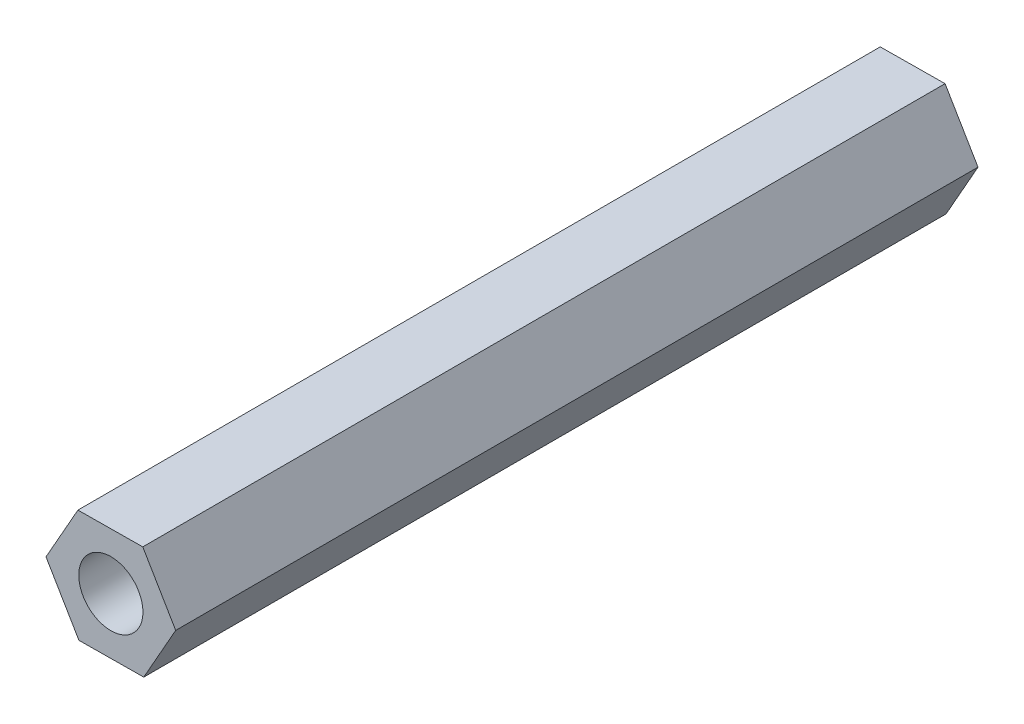
ISO-10303-21;
HEADER;
FILE_DESCRIPTION(('STEP AP214'),'2;1');
FILE_NAME('part.step','',(''),(''),'','','');
FILE_SCHEMA(('AUTOMOTIVE_DESIGN { 1 0 10303 214 1 1 1 1 }'));
ENDSEC;
DATA;
#1=APPLICATION_CONTEXT('core data for automotive mechanical design processes');
#2=APPLICATION_PROTOCOL_DEFINITION('international standard','automotive_design',2000,#1);
#3=PRODUCT_CONTEXT('',#1,'mechanical');
#4=PRODUCT('Part','Part','',(#3));
#5=PRODUCT_RELATED_PRODUCT_CATEGORY('part','',(#4));
#6=PRODUCT_DEFINITION_FORMATION('','',#4);
#7=PRODUCT_DEFINITION_CONTEXT('part definition',#1,'design');
#8=PRODUCT_DEFINITION('design','',#6,#7);
#9=PRODUCT_DEFINITION_SHAPE('','',#8);
#10=(LENGTH_UNIT() NAMED_UNIT(*) SI_UNIT(.MILLI.,.METRE.));
#11=(NAMED_UNIT(*) PLANE_ANGLE_UNIT() SI_UNIT($,.RADIAN.));
#12=(NAMED_UNIT(*) SI_UNIT($,.STERADIAN.) SOLID_ANGLE_UNIT());
#13=UNCERTAINTY_MEASURE_WITH_UNIT(LENGTH_MEASURE(1.E-05),#10,'distance_accuracy_value','');
#14=(GEOMETRIC_REPRESENTATION_CONTEXT(3) GLOBAL_UNCERTAINTY_ASSIGNED_CONTEXT((#13)) GLOBAL_UNIT_ASSIGNED_CONTEXT((#10,
#11,#12)) REPRESENTATION_CONTEXT('',''));
#15=CARTESIAN_POINT('',(0.,0.,0.));
#16=DIRECTION('',(0.,0.,1.));
#17=DIRECTION('',(1.,0.,0.));
#18=AXIS2_PLACEMENT_3D('',#15,#16,#17);
#19=CARTESIAN_POINT('',(0.,0.,50.));
#20=DIRECTION('',(0.,0.,1.));
#21=DIRECTION('',(1.,0.,0.));
#22=AXIS2_PLACEMENT_3D('',#19,#20,#21);
#23=PLANE('',#22);
#24=DIRECTION('',(0.999961257640527,0.00880245522430722,0.));
#25=VECTOR('',#24,1.);
#26=CARTESIAN_POINT('',(-1.98983906118775,-3.51765175136834,50.));
#27=LINE('',#26,#25);
#28=CARTESIAN_POINT('',(-1.98983906118775,-3.51765175136834,50.));
#29=VERTEX_POINT('',#28);
#30=CARTESIAN_POINT('',(2.05145624775792,-3.48207705211536,50.));
#31=VERTEX_POINT('',#30);
#32=EDGE_CURVE('E133',#29,#31,#27,.T.);
#33=ORIENTED_EDGE('',*,*,#32,.T.);
#34=DIRECTION('',(0.492357478980338,0.870393079529086,0.));
#35=VECTOR('',#34,1.);
#36=CARTESIAN_POINT('',(2.05145624775792,-3.48207705211536,50.));
#37=LINE('',#36,#35);
#38=CARTESIAN_POINT('',(4.04129530894568,0.0355746992529791,50.));
#39=VERTEX_POINT('',#38);
#40=EDGE_CURVE('E91',#31,#39,#37,.T.);
#41=ORIENTED_EDGE('',*,*,#40,.T.);
#42=DIRECTION('',(-0.507603778660189,0.861590624304779,0.));
#43=VECTOR('',#42,1.);
#44=CARTESIAN_POINT('',(4.04129530894568,0.0355746992529791,50.));
#45=LINE('',#44,#43);
#46=CARTESIAN_POINT('',(1.98983906118776,3.51765175136834,50.));
#47=VERTEX_POINT('',#46);
#48=EDGE_CURVE('E104',#39,#47,#45,.T.);
#49=ORIENTED_EDGE('',*,*,#48,.T.);
#50=DIRECTION('',(-0.999961257640527,-0.00880245522430723,0.));
#51=VECTOR('',#50,1.);
#52=CARTESIAN_POINT('',(1.98983906118776,3.51765175136834,50.));
#53=LINE('',#52,#51);
#54=CARTESIAN_POINT('',(-2.05145624775791,3.48207705211536,50.));
#55=VERTEX_POINT('',#54);
#56=EDGE_CURVE('E98',#47,#55,#53,.T.);
#57=ORIENTED_EDGE('',*,*,#56,.T.);
#58=DIRECTION('',(-0.492357478980338,-0.870393079529086,0.));
#59=VECTOR('',#58,1.);
#60=CARTESIAN_POINT('',(-2.05145624775791,3.48207705211536,50.));
#61=LINE('',#60,#59);
#62=CARTESIAN_POINT('',(-4.04129530894568,-0.0355746992529825,50.));
#63=VERTEX_POINT('',#62);
#64=EDGE_CURVE('E102',#55,#63,#61,.T.);
#65=ORIENTED_EDGE('',*,*,#64,.T.);
#66=DIRECTION('',(0.507603778660189,-0.861590624304779,0.));
#67=VECTOR('',#66,1.);
#68=CARTESIAN_POINT('',(-4.04129530894568,-0.0355746992529825,50.));
#69=LINE('',#68,#67);
#70=EDGE_CURVE('E54',#63,#29,#69,.T.);
#71=ORIENTED_EDGE('',*,*,#70,.T.);
#72=EDGE_LOOP('',(#33,#41,#49,#57,#65,#71));
#73=FACE_BOUND('',#72,.T.);
#74=CARTESIAN_POINT('',(0.,0.,50.));
#75=DIRECTION('',(0.,0.,1.));
#76=DIRECTION('',(1.,0.,0.));
#77=AXIS2_PLACEMENT_3D('',#74,#75,#76);
#78=CIRCLE('',#77,2.);
#79=CARTESIAN_POINT('',(2.,0.,50.));
#80=VERTEX_POINT('',#79);
#81=EDGE_CURVE('E126',#80,#80,#78,.T.);
#82=ORIENTED_EDGE('',*,*,#81,.F.);
#83=EDGE_LOOP('',(#82));
#84=FACE_BOUND('',#83,.T.);
#85=ADVANCED_FACE('F37',(#73,#84),#23,.T.);
#86=CARTESIAN_POINT('',(0.,0.,0.));
#87=DIRECTION('',(0.,0.,1.));
#88=DIRECTION('',(1.,0.,0.));
#89=AXIS2_PLACEMENT_3D('',#86,#87,#88);
#90=PLANE('',#89);
#91=DIRECTION('',(0.999961257640527,0.00880245522430722,0.));
#92=VECTOR('',#91,1.);
#93=CARTESIAN_POINT('',(-1.98983906118775,-3.51765175136834,0.));
#94=LINE('',#93,#92);
#95=CARTESIAN_POINT('',(-1.98983906118775,-3.51765175136834,0.));
#96=VERTEX_POINT('',#95);
#97=CARTESIAN_POINT('',(2.05145624775792,-3.48207705211536,0.));
#98=VERTEX_POINT('',#97);
#99=EDGE_CURVE('E122',#96,#98,#94,.T.);
#100=ORIENTED_EDGE('',*,*,#99,.F.);
#101=DIRECTION('',(0.507603778660189,-0.861590624304779,0.));
#102=VECTOR('',#101,1.);
#103=CARTESIAN_POINT('',(-4.04129530894568,-0.0355746992529825,0.));
#104=LINE('',#103,#102);
#105=CARTESIAN_POINT('',(-4.04129530894568,-0.0355746992529825,0.));
#106=VERTEX_POINT('',#105);
#107=EDGE_CURVE('E83',#106,#96,#104,.T.);
#108=ORIENTED_EDGE('',*,*,#107,.F.);
#109=DIRECTION('',(-0.492357478980338,-0.870393079529086,0.));
#110=VECTOR('',#109,1.);
#111=CARTESIAN_POINT('',(-2.05145624775791,3.48207705211536,0.));
#112=LINE('',#111,#110);
#113=CARTESIAN_POINT('',(-2.05145624775791,3.48207705211536,0.));
#114=VERTEX_POINT('',#113);
#115=EDGE_CURVE('E77',#114,#106,#112,.T.);
#116=ORIENTED_EDGE('',*,*,#115,.F.);
#117=DIRECTION('',(-0.999961257640527,-0.00880245522430723,0.));
#118=VECTOR('',#117,1.);
#119=CARTESIAN_POINT('',(1.98983906118776,3.51765175136834,0.));
#120=LINE('',#119,#118);
#121=CARTESIAN_POINT('',(1.98983906118776,3.51765175136834,0.));
#122=VERTEX_POINT('',#121);
#123=EDGE_CURVE('E112',#122,#114,#120,.T.);
#124=ORIENTED_EDGE('',*,*,#123,.F.);
#125=DIRECTION('',(-0.507603778660189,0.861590624304779,0.));
#126=VECTOR('',#125,1.);
#127=CARTESIAN_POINT('',(4.04129530894568,0.0355746992529791,0.));
#128=LINE('',#127,#126);
#129=CARTESIAN_POINT('',(4.04129530894568,0.0355746992529791,0.));
#130=VERTEX_POINT('',#129);
#131=EDGE_CURVE('E128',#130,#122,#128,.T.);
#132=ORIENTED_EDGE('',*,*,#131,.F.);
#133=DIRECTION('',(0.492357478980338,0.870393079529086,0.));
#134=VECTOR('',#133,1.);
#135=CARTESIAN_POINT('',(2.05145624775792,-3.48207705211536,0.));
#136=LINE('',#135,#134);
#137=EDGE_CURVE('E125',#98,#130,#136,.T.);
#138=ORIENTED_EDGE('',*,*,#137,.F.);
#139=EDGE_LOOP('',(#100,#108,#116,#124,#132,#138));
#140=FACE_BOUND('',#139,.T.);
#141=CARTESIAN_POINT('',(0.,0.,0.));
#142=DIRECTION('',(0.,0.,1.));
#143=DIRECTION('',(1.,0.,0.));
#144=AXIS2_PLACEMENT_3D('',#141,#142,#143);
#145=CIRCLE('',#144,2.);
#146=CARTESIAN_POINT('',(2.,0.,0.));
#147=VERTEX_POINT('',#146);
#148=EDGE_CURVE('E226',#147,#147,#145,.T.);
#149=ORIENTED_EDGE('',*,*,#148,.T.);
#150=EDGE_LOOP('',(#149));
#151=FACE_BOUND('',#150,.T.);
#152=ADVANCED_FACE('F142',(#140,#151),#90,.F.);
#153=CARTESIAN_POINT('',(-1.98983906118775,-3.51765175136834,50.));
#154=DIRECTION('',(-0.00880245522430722,0.999961257640527,0.));
#155=DIRECTION('',(-0.999961257640527,-0.00880245522430722,0.));
#156=AXIS2_PLACEMENT_3D('',#153,#154,#155);
#157=PLANE('',#156);
#158=ORIENTED_EDGE('',*,*,#99,.T.);
#159=DIRECTION('',(0.,0.,-1.));
#160=VECTOR('',#159,1.);
#161=CARTESIAN_POINT('',(2.05145624775792,-3.48207705211536,50.));
#162=LINE('',#161,#160);
#163=EDGE_CURVE('E11',#31,#98,#162,.T.);
#164=ORIENTED_EDGE('',*,*,#163,.F.);
#165=ORIENTED_EDGE('',*,*,#32,.F.);
#166=DIRECTION('',(0.,0.,-1.));
#167=VECTOR('',#166,1.);
#168=CARTESIAN_POINT('',(-1.98983906118775,-3.51765175136834,50.));
#169=LINE('',#168,#167);
#170=EDGE_CURVE('E118',#29,#96,#169,.T.);
#171=ORIENTED_EDGE('',*,*,#170,.T.);
#172=EDGE_LOOP('',(#158,#164,#165,#171));
#173=FACE_BOUND('',#172,.T.);
#174=ADVANCED_FACE('F39',(#173),#157,.F.);
#175=CARTESIAN_POINT('',(2.05145624775792,-3.48207705211536,50.));
#176=DIRECTION('',(-0.870393079529086,0.492357478980338,0.));
#177=DIRECTION('',(-0.492357478980338,-0.870393079529086,0.));
#178=AXIS2_PLACEMENT_3D('',#175,#176,#177);
#179=PLANE('',#178);
#180=ORIENTED_EDGE('',*,*,#137,.T.);
#181=DIRECTION('',(0.,0.,-1.));
#182=VECTOR('',#181,1.);
#183=CARTESIAN_POINT('',(4.04129530894568,0.0355746992529791,50.));
#184=LINE('',#183,#182);
#185=EDGE_CURVE('E46',#39,#130,#184,.T.);
#186=ORIENTED_EDGE('',*,*,#185,.F.);
#187=ORIENTED_EDGE('',*,*,#40,.F.);
#188=ORIENTED_EDGE('',*,*,#163,.T.);
#189=EDGE_LOOP('',(#180,#186,#187,#188));
#190=FACE_BOUND('',#189,.T.);
#191=ADVANCED_FACE('F167',(#190),#179,.F.);
#192=CARTESIAN_POINT('',(4.04129530894568,0.0355746992529791,50.));
#193=DIRECTION('',(-0.861590624304779,-0.507603778660189,0.));
#194=DIRECTION('',(0.507603778660189,-0.861590624304779,0.));
#195=AXIS2_PLACEMENT_3D('',#192,#193,#194);
#196=PLANE('',#195);
#197=ORIENTED_EDGE('',*,*,#131,.T.);
#198=DIRECTION('',(0.,0.,-1.));
#199=VECTOR('',#198,1.);
#200=CARTESIAN_POINT('',(1.98983906118776,3.51765175136834,50.));
#201=LINE('',#200,#199);
#202=EDGE_CURVE('E113',#47,#122,#201,.T.);
#203=ORIENTED_EDGE('',*,*,#202,.F.);
#204=ORIENTED_EDGE('',*,*,#48,.F.);
#205=ORIENTED_EDGE('',*,*,#185,.T.);
#206=EDGE_LOOP('',(#197,#203,#204,#205));
#207=FACE_BOUND('',#206,.T.);
#208=ADVANCED_FACE('F139',(#207),#196,.F.);
#209=CARTESIAN_POINT('',(1.98983906118776,3.51765175136834,50.));
#210=DIRECTION('',(0.00880245522430723,-0.999961257640527,0.));
#211=DIRECTION('',(0.999961257640527,0.00880245522430723,0.));
#212=AXIS2_PLACEMENT_3D('',#209,#210,#211);
#213=PLANE('',#212);
#214=ORIENTED_EDGE('',*,*,#123,.T.);
#215=DIRECTION('',(0.,0.,-1.));
#216=VECTOR('',#215,1.);
#217=CARTESIAN_POINT('',(-2.05145624775791,3.48207705211536,50.));
#218=LINE('',#217,#216);
#219=EDGE_CURVE('E109',#55,#114,#218,.T.);
#220=ORIENTED_EDGE('',*,*,#219,.F.);
#221=ORIENTED_EDGE('',*,*,#56,.F.);
#222=ORIENTED_EDGE('',*,*,#202,.T.);
#223=EDGE_LOOP('',(#214,#220,#221,#222));
#224=FACE_BOUND('',#223,.T.);
#225=ADVANCED_FACE('F110',(#224),#213,.F.);
#226=CARTESIAN_POINT('',(-2.05145624775791,3.48207705211536,50.));
#227=DIRECTION('',(0.870393079529086,-0.492357478980338,0.));
#228=DIRECTION('',(0.492357478980338,0.870393079529086,0.));
#229=AXIS2_PLACEMENT_3D('',#226,#227,#228);
#230=PLANE('',#229);
#231=ORIENTED_EDGE('',*,*,#115,.T.);
#232=DIRECTION('',(0.,0.,-1.));
#233=VECTOR('',#232,1.);
#234=CARTESIAN_POINT('',(-4.04129530894568,-0.0355746992529825,50.));
#235=LINE('',#234,#233);
#236=EDGE_CURVE('E114',#63,#106,#235,.T.);
#237=ORIENTED_EDGE('',*,*,#236,.F.);
#238=ORIENTED_EDGE('',*,*,#64,.F.);
#239=ORIENTED_EDGE('',*,*,#219,.T.);
#240=EDGE_LOOP('',(#231,#237,#238,#239));
#241=FACE_BOUND('',#240,.T.);
#242=ADVANCED_FACE('F116',(#241),#230,.F.);
#243=CARTESIAN_POINT('',(-4.04129530894568,-0.0355746992529825,50.));
#244=DIRECTION('',(0.861590624304779,0.507603778660189,0.));
#245=DIRECTION('',(-0.507603778660189,0.861590624304779,0.));
#246=AXIS2_PLACEMENT_3D('',#243,#244,#245);
#247=PLANE('',#246);
#248=ORIENTED_EDGE('',*,*,#107,.T.);
#249=ORIENTED_EDGE('',*,*,#170,.F.);
#250=ORIENTED_EDGE('',*,*,#70,.F.);
#251=ORIENTED_EDGE('',*,*,#236,.T.);
#252=EDGE_LOOP('',(#248,#249,#250,#251));
#253=FACE_BOUND('',#252,.T.);
#254=ADVANCED_FACE('F147',(#253),#247,.F.);
#255=CARTESIAN_POINT('',(0.,0.,50.));
#256=DIRECTION('',(0.,0.,-1.));
#257=DIRECTION('',(-1.,0.,0.));
#258=AXIS2_PLACEMENT_3D('',#255,#256,#257);
#259=CYLINDRICAL_SURFACE('',#258,2.);
#260=ORIENTED_EDGE('',*,*,#81,.T.);
#261=EDGE_LOOP('',(#260));
#262=FACE_BOUND('',#261,.T.);
#263=ORIENTED_EDGE('',*,*,#148,.F.);
#264=EDGE_LOOP('',(#263));
#265=FACE_BOUND('',#264,.T.);
#266=ADVANCED_FACE('F149',(#262,#265),#259,.F.);
#267=CLOSED_SHELL('',(#85,#152,#174,#191,#208,#225,#242,#254,#266));
#268=MANIFOLD_SOLID_BREP('B2',#267);
#269=ADVANCED_BREP_SHAPE_REPRESENTATION('',(#18,#268),#14);
#270=SHAPE_DEFINITION_REPRESENTATION(#9,#269);
ENDSEC;
END-ISO-10303-21;
